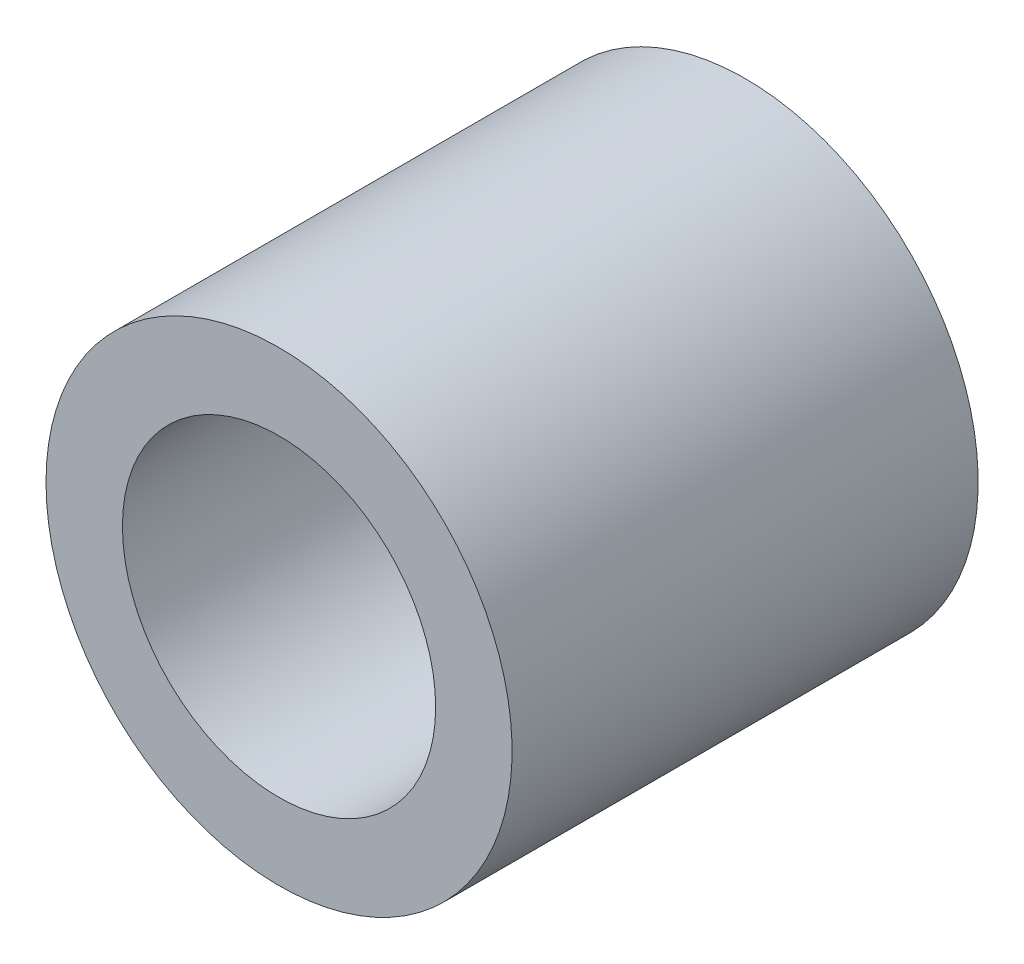
ISO-10303-21;
HEADER;
FILE_DESCRIPTION(('STEP AP214'),'2;1');
FILE_NAME('part.step','',(''),(''),'','','');
FILE_SCHEMA(('AUTOMOTIVE_DESIGN { 1 0 10303 214 1 1 1 1 }'));
ENDSEC;
DATA;
#1=APPLICATION_CONTEXT('core data for automotive mechanical design processes');
#2=APPLICATION_PROTOCOL_DEFINITION('international standard','automotive_design',2000,#1);
#3=PRODUCT_CONTEXT('',#1,'mechanical');
#4=PRODUCT('Part','Part','',(#3));
#5=PRODUCT_RELATED_PRODUCT_CATEGORY('part','',(#4));
#6=PRODUCT_DEFINITION_FORMATION('','',#4);
#7=PRODUCT_DEFINITION_CONTEXT('part definition',#1,'design');
#8=PRODUCT_DEFINITION('design','',#6,#7);
#9=PRODUCT_DEFINITION_SHAPE('','',#8);
#10=(LENGTH_UNIT() NAMED_UNIT(*) SI_UNIT(.MILLI.,.METRE.));
#11=(NAMED_UNIT(*) PLANE_ANGLE_UNIT() SI_UNIT($,.RADIAN.));
#12=(NAMED_UNIT(*) SI_UNIT($,.STERADIAN.) SOLID_ANGLE_UNIT());
#13=UNCERTAINTY_MEASURE_WITH_UNIT(LENGTH_MEASURE(1.E-05),#10,'distance_accuracy_value','');
#14=(GEOMETRIC_REPRESENTATION_CONTEXT(3) GLOBAL_UNCERTAINTY_ASSIGNED_CONTEXT((#13)) GLOBAL_UNIT_ASSIGNED_CONTEXT((#10,
#11,#12)) REPRESENTATION_CONTEXT('',''));
#15=CARTESIAN_POINT('',(0.,0.,0.));
#16=DIRECTION('',(0.,0.,1.));
#17=DIRECTION('',(1.,0.,0.));
#18=AXIS2_PLACEMENT_3D('',#15,#16,#17);
#19=CARTESIAN_POINT('',(0.,0.,4.7625));
#20=DIRECTION('',(0.,0.,1.));
#21=DIRECTION('',(1.,0.,0.));
#22=AXIS2_PLACEMENT_3D('',#19,#20,#21);
#23=PLANE('',#22);
#24=CARTESIAN_POINT('',(0.,0.,4.7625));
#25=DIRECTION('',(0.,0.,1.));
#26=DIRECTION('',(1.,0.,0.));
#27=AXIS2_PLACEMENT_3D('',#24,#25,#26);
#28=CIRCLE('',#27,4.7625);
#29=CARTESIAN_POINT('',(-4.7625,0.,4.7625));
#30=VERTEX_POINT('',#29);
#31=EDGE_CURVE('E10',#30,#30,#28,.T.);
#32=ORIENTED_EDGE('',*,*,#31,.T.);
#33=EDGE_LOOP('',(#32));
#34=FACE_BOUND('',#33,.T.);
#35=CARTESIAN_POINT('',(0.,0.,4.7625));
#36=DIRECTION('',(0.,0.,1.));
#37=DIRECTION('',(1.,0.,0.));
#38=AXIS2_PLACEMENT_3D('',#35,#36,#37);
#39=CIRCLE('',#38,3.2004);
#40=CARTESIAN_POINT('',(-3.2004,0.,4.7625));
#41=VERTEX_POINT('',#40);
#42=EDGE_CURVE('E41',#41,#41,#39,.T.);
#43=ORIENTED_EDGE('',*,*,#42,.F.);
#44=EDGE_LOOP('',(#43));
#45=FACE_BOUND('',#44,.T.);
#46=ADVANCED_FACE('F30',(#34,#45),#23,.T.);
#47=CARTESIAN_POINT('',(0.,0.,-4.7625));
#48=DIRECTION('',(0.,0.,1.));
#49=DIRECTION('',(1.,0.,0.));
#50=AXIS2_PLACEMENT_3D('',#47,#48,#49);
#51=PLANE('',#50);
#52=CARTESIAN_POINT('',(0.,0.,-4.7625));
#53=DIRECTION('',(0.,0.,1.));
#54=DIRECTION('',(1.,0.,0.));
#55=AXIS2_PLACEMENT_3D('',#52,#53,#54);
#56=CIRCLE('',#55,4.7625);
#57=CARTESIAN_POINT('',(-4.7625,0.,-4.7625));
#58=VERTEX_POINT('',#57);
#59=EDGE_CURVE('E34',#58,#58,#56,.T.);
#60=ORIENTED_EDGE('',*,*,#59,.F.);
#61=EDGE_LOOP('',(#60));
#62=FACE_BOUND('',#61,.T.);
#63=CARTESIAN_POINT('',(0.,0.,-4.7625));
#64=DIRECTION('',(0.,0.,1.));
#65=DIRECTION('',(1.,0.,0.));
#66=AXIS2_PLACEMENT_3D('',#63,#64,#65);
#67=CIRCLE('',#66,3.2004);
#68=CARTESIAN_POINT('',(-3.2004,0.,-4.7625));
#69=VERTEX_POINT('',#68);
#70=EDGE_CURVE('E43',#69,#69,#67,.T.);
#71=ORIENTED_EDGE('',*,*,#70,.T.);
#72=EDGE_LOOP('',(#71));
#73=FACE_BOUND('',#72,.T.);
#74=ADVANCED_FACE('F53',(#62,#73),#51,.F.);
#75=CARTESIAN_POINT('',(0.,0.,4.7625));
#76=DIRECTION('',(0.,0.,-1.));
#77=DIRECTION('',(-1.,0.,0.));
#78=AXIS2_PLACEMENT_3D('',#75,#76,#77);
#79=CYLINDRICAL_SURFACE('',#78,4.7625);
#80=CARTESIAN_POINT('',(-4.7625,0.,4.7625));
#81=CARTESIAN_POINT('',(-4.7625,0.,4.66328125));
#82=CARTESIAN_POINT('',(-4.7625,0.,4.5640625));
#83=CARTESIAN_POINT('',(-4.7625,0.,4.365625));
#84=CARTESIAN_POINT('',(-4.7625,0.,4.26640625));
#85=CARTESIAN_POINT('',(-4.7625,0.,4.06796875));
#86=CARTESIAN_POINT('',(-4.7625,0.,3.96875));
#87=CARTESIAN_POINT('',(-4.7625,0.,3.7703125));
#88=CARTESIAN_POINT('',(-4.7625,0.,3.67109375));
#89=CARTESIAN_POINT('',(-4.7625,0.,3.47265625));
#90=CARTESIAN_POINT('',(-4.7625,0.,3.3734375));
#91=CARTESIAN_POINT('',(-4.7625,0.,3.175));
#92=CARTESIAN_POINT('',(-4.7625,0.,3.07578125));
#93=CARTESIAN_POINT('',(-4.7625,0.,2.87734375));
#94=CARTESIAN_POINT('',(-4.7625,0.,2.778125));
#95=CARTESIAN_POINT('',(-4.7625,0.,2.5796875));
#96=CARTESIAN_POINT('',(-4.7625,0.,2.48046875));
#97=CARTESIAN_POINT('',(-4.7625,0.,2.28203125));
#98=CARTESIAN_POINT('',(-4.7625,0.,2.1828125));
#99=CARTESIAN_POINT('',(-4.7625,0.,1.984375));
#100=CARTESIAN_POINT('',(-4.7625,0.,1.88515625));
#101=CARTESIAN_POINT('',(-4.7625,0.,1.68671875));
#102=CARTESIAN_POINT('',(-4.7625,0.,1.5875));
#103=CARTESIAN_POINT('',(-4.7625,0.,1.3890625));
#104=CARTESIAN_POINT('',(-4.7625,0.,1.28984375));
#105=CARTESIAN_POINT('',(-4.7625,0.,1.09140625));
#106=CARTESIAN_POINT('',(-4.7625,0.,0.992187499999999));
#107=CARTESIAN_POINT('',(-4.7625,0.,0.79375));
#108=CARTESIAN_POINT('',(-4.7625,0.,0.69453125));
#109=CARTESIAN_POINT('',(-4.7625,0.,0.49609375));
#110=CARTESIAN_POINT('',(-4.7625,0.,0.396875));
#111=CARTESIAN_POINT('',(-4.7625,0.,0.1984375));
#112=CARTESIAN_POINT('',(-4.7625,0.,0.0992187500000001));
#113=CARTESIAN_POINT('',(-4.7625,0.,-0.0992187500000001));
#114=CARTESIAN_POINT('',(-4.7625,0.,-0.1984375));
#115=CARTESIAN_POINT('',(-4.7625,0.,-0.396875));
#116=CARTESIAN_POINT('',(-4.7625,0.,-0.49609375));
#117=CARTESIAN_POINT('',(-4.7625,0.,-0.69453125));
#118=CARTESIAN_POINT('',(-4.7625,0.,-0.793750000000001));
#119=CARTESIAN_POINT('',(-4.7625,0.,-0.992187500000001));
#120=CARTESIAN_POINT('',(-4.7625,0.,-1.09140625));
#121=CARTESIAN_POINT('',(-4.7625,0.,-1.28984375));
#122=CARTESIAN_POINT('',(-4.7625,0.,-1.3890625));
#123=CARTESIAN_POINT('',(-4.7625,0.,-1.5875));
#124=CARTESIAN_POINT('',(-4.7625,0.,-1.68671875));
#125=CARTESIAN_POINT('',(-4.7625,0.,-1.88515625));
#126=CARTESIAN_POINT('',(-4.7625,0.,-1.984375));
#127=CARTESIAN_POINT('',(-4.7625,0.,-2.1828125));
#128=CARTESIAN_POINT('',(-4.7625,0.,-2.28203125));
#129=CARTESIAN_POINT('',(-4.7625,0.,-2.48046875));
#130=CARTESIAN_POINT('',(-4.7625,0.,-2.5796875));
#131=CARTESIAN_POINT('',(-4.7625,0.,-2.778125));
#132=CARTESIAN_POINT('',(-4.7625,0.,-2.87734375));
#133=CARTESIAN_POINT('',(-4.7625,0.,-3.07578125));
#134=CARTESIAN_POINT('',(-4.7625,0.,-3.175));
#135=CARTESIAN_POINT('',(-4.7625,0.,-3.3734375));
#136=CARTESIAN_POINT('',(-4.7625,0.,-3.47265625));
#137=CARTESIAN_POINT('',(-4.7625,0.,-3.67109375));
#138=CARTESIAN_POINT('',(-4.7625,0.,-3.7703125));
#139=CARTESIAN_POINT('',(-4.7625,0.,-3.96875));
#140=CARTESIAN_POINT('',(-4.7625,0.,-4.06796875));
#141=CARTESIAN_POINT('',(-4.7625,0.,-4.26640625));
#142=CARTESIAN_POINT('',(-4.7625,0.,-4.365625));
#143=CARTESIAN_POINT('',(-4.7625,0.,-4.5640625));
#144=CARTESIAN_POINT('',(-4.7625,0.,-4.66328125));
#145=CARTESIAN_POINT('',(-4.7625,0.,-4.7625));
#146=B_SPLINE_CURVE_WITH_KNOTS('',3,(#80,#81,#82,#83,#84,#85,#86,#87,#88,#89,#90,#91,#92,#93,
#94,#95,#96,#97,#98,#99,#100,#101,#102,#103,#104,#105,#106,#107,#108,#109,#110,#111,#112,#113,
#114,#115,#116,#117,#118,#119,#120,#121,#122,#123,#124,#125,#126,#127,#128,#129,#130,#131,#132,
#133,#134,#135,#136,#137,#138,#139,#140,#141,#142,#143,#144,#145),.UNSPECIFIED.,.F.,.F.,(4,2,2,
2,2,2,2,2,2,2,2,2,2,2,2,2,2,2,2,2,2,2,2,2,2,2,2,2,2,2,2,2,4),(0.,0.29765625,0.5953125,
0.892968750000001,1.190625,1.48828125,1.7859375,2.08359375,2.38125,2.67890625,2.9765625,
3.27421875,3.571875,3.86953125,4.1671875,4.46484375,4.7625,5.06015625,5.3578125,5.65546875,
5.953125,6.25078125,6.5484375,6.84609375,7.14375,7.44140625,7.7390625,8.03671875,8.334375,
8.63203125,8.9296875,9.22734375,9.525),.UNSPECIFIED.);
#147=EDGE_CURVE('BSEAM32',#30,#58,#146,.T.);
#148=ORIENTED_EDGE('',*,*,#31,.F.);
#149=ORIENTED_EDGE('',*,*,#59,.T.);
#150=ORIENTED_EDGE('',*,*,#147,.T.);
#151=ORIENTED_EDGE('',*,*,#147,.F.);
#152=EDGE_LOOP('',(#148,#150,#149,#151));
#153=FACE_BOUND('',#152,.T.);
#154=ADVANCED_FACE('F32',(#153),#79,.T.);
#155=CARTESIAN_POINT('',(0.,0.,4.7625));
#156=DIRECTION('',(0.,0.,-1.));
#157=DIRECTION('',(-1.,0.,0.));
#158=AXIS2_PLACEMENT_3D('',#155,#156,#157);
#159=CYLINDRICAL_SURFACE('',#158,3.2004);
#160=CARTESIAN_POINT('',(-3.2004,0.,4.7625));
#161=CARTESIAN_POINT('',(-3.2004,0.,4.66328125));
#162=CARTESIAN_POINT('',(-3.2004,0.,4.5640625));
#163=CARTESIAN_POINT('',(-3.2004,0.,4.365625));
#164=CARTESIAN_POINT('',(-3.2004,0.,4.26640625));
#165=CARTESIAN_POINT('',(-3.2004,0.,4.06796875));
#166=CARTESIAN_POINT('',(-3.2004,0.,3.96875));
#167=CARTESIAN_POINT('',(-3.2004,0.,3.7703125));
#168=CARTESIAN_POINT('',(-3.2004,0.,3.67109375));
#169=CARTESIAN_POINT('',(-3.2004,0.,3.47265625));
#170=CARTESIAN_POINT('',(-3.2004,0.,3.3734375));
#171=CARTESIAN_POINT('',(-3.2004,0.,3.175));
#172=CARTESIAN_POINT('',(-3.2004,0.,3.07578125));
#173=CARTESIAN_POINT('',(-3.2004,0.,2.87734375));
#174=CARTESIAN_POINT('',(-3.2004,0.,2.778125));
#175=CARTESIAN_POINT('',(-3.2004,0.,2.5796875));
#176=CARTESIAN_POINT('',(-3.2004,0.,2.48046875));
#177=CARTESIAN_POINT('',(-3.2004,0.,2.28203125));
#178=CARTESIAN_POINT('',(-3.2004,0.,2.1828125));
#179=CARTESIAN_POINT('',(-3.2004,0.,1.984375));
#180=CARTESIAN_POINT('',(-3.2004,0.,1.88515625));
#181=CARTESIAN_POINT('',(-3.2004,0.,1.68671875));
#182=CARTESIAN_POINT('',(-3.2004,0.,1.5875));
#183=CARTESIAN_POINT('',(-3.2004,0.,1.3890625));
#184=CARTESIAN_POINT('',(-3.2004,0.,1.28984375));
#185=CARTESIAN_POINT('',(-3.2004,0.,1.09140625));
#186=CARTESIAN_POINT('',(-3.2004,0.,0.992187499999999));
#187=CARTESIAN_POINT('',(-3.2004,0.,0.79375));
#188=CARTESIAN_POINT('',(-3.2004,0.,0.69453125));
#189=CARTESIAN_POINT('',(-3.2004,0.,0.49609375));
#190=CARTESIAN_POINT('',(-3.2004,0.,0.396875));
#191=CARTESIAN_POINT('',(-3.2004,0.,0.1984375));
#192=CARTESIAN_POINT('',(-3.2004,0.,0.0992187500000001));
#193=CARTESIAN_POINT('',(-3.2004,0.,-0.0992187500000001));
#194=CARTESIAN_POINT('',(-3.2004,0.,-0.1984375));
#195=CARTESIAN_POINT('',(-3.2004,0.,-0.396875));
#196=CARTESIAN_POINT('',(-3.2004,0.,-0.49609375));
#197=CARTESIAN_POINT('',(-3.2004,0.,-0.69453125));
#198=CARTESIAN_POINT('',(-3.2004,0.,-0.793750000000001));
#199=CARTESIAN_POINT('',(-3.2004,0.,-0.992187500000001));
#200=CARTESIAN_POINT('',(-3.2004,0.,-1.09140625));
#201=CARTESIAN_POINT('',(-3.2004,0.,-1.28984375));
#202=CARTESIAN_POINT('',(-3.2004,0.,-1.3890625));
#203=CARTESIAN_POINT('',(-3.2004,0.,-1.5875));
#204=CARTESIAN_POINT('',(-3.2004,0.,-1.68671875));
#205=CARTESIAN_POINT('',(-3.2004,0.,-1.88515625));
#206=CARTESIAN_POINT('',(-3.2004,0.,-1.984375));
#207=CARTESIAN_POINT('',(-3.2004,0.,-2.1828125));
#208=CARTESIAN_POINT('',(-3.2004,0.,-2.28203125));
#209=CARTESIAN_POINT('',(-3.2004,0.,-2.48046875));
#210=CARTESIAN_POINT('',(-3.2004,0.,-2.5796875));
#211=CARTESIAN_POINT('',(-3.2004,0.,-2.778125));
#212=CARTESIAN_POINT('',(-3.2004,0.,-2.87734375));
#213=CARTESIAN_POINT('',(-3.2004,0.,-3.07578125));
#214=CARTESIAN_POINT('',(-3.2004,0.,-3.175));
#215=CARTESIAN_POINT('',(-3.2004,0.,-3.3734375));
#216=CARTESIAN_POINT('',(-3.2004,0.,-3.47265625));
#217=CARTESIAN_POINT('',(-3.2004,0.,-3.67109375));
#218=CARTESIAN_POINT('',(-3.2004,0.,-3.7703125));
#219=CARTESIAN_POINT('',(-3.2004,0.,-3.96875));
#220=CARTESIAN_POINT('',(-3.2004,0.,-4.06796875));
#221=CARTESIAN_POINT('',(-3.2004,0.,-4.26640625));
#222=CARTESIAN_POINT('',(-3.2004,0.,-4.365625));
#223=CARTESIAN_POINT('',(-3.2004,0.,-4.5640625));
#224=CARTESIAN_POINT('',(-3.2004,0.,-4.66328125));
#225=CARTESIAN_POINT('',(-3.2004,0.,-4.7625));
#226=B_SPLINE_CURVE_WITH_KNOTS('',3,(#160,#161,#162,#163,#164,#165,#166,#167,#168,#169,#170,
#171,#172,#173,#174,#175,#176,#177,#178,#179,#180,#181,#182,#183,#184,#185,#186,#187,#188,#189,
#190,#191,#192,#193,#194,#195,#196,#197,#198,#199,#200,#201,#202,#203,#204,#205,#206,#207,#208,
#209,#210,#211,#212,#213,#214,#215,#216,#217,#218,#219,#220,#221,#222,#223,#224,#225),
.UNSPECIFIED.,.F.,.F.,(4,2,2,2,2,2,2,2,2,2,2,2,2,2,2,2,2,2,2,2,2,2,2,2,2,2,2,2,2,2,2,2,4),(0.,
0.29765625,0.5953125,0.892968750000001,1.190625,1.48828125,1.7859375,2.08359375,2.38125,
2.67890625,2.9765625,3.27421875,3.571875,3.86953125,4.1671875,4.46484375,4.7625,5.06015625,
5.3578125,5.65546875,5.953125,6.25078125,6.5484375,6.84609375,7.14375,7.44140625,7.7390625,
8.03671875,8.334375,8.63203125,8.9296875,9.22734375,9.525),.UNSPECIFIED.);
#227=EDGE_CURVE('BSEAM49',#41,#69,#226,.T.);
#228=ORIENTED_EDGE('',*,*,#42,.T.);
#229=ORIENTED_EDGE('',*,*,#70,.F.);
#230=ORIENTED_EDGE('',*,*,#227,.T.);
#231=ORIENTED_EDGE('',*,*,#227,.F.);
#232=EDGE_LOOP('',(#228,#230,#229,#231));
#233=FACE_BOUND('',#232,.T.);
#234=ADVANCED_FACE('F49',(#233),#159,.F.);
#235=CLOSED_SHELL('',(#46,#74,#154,#234));
#236=MANIFOLD_SOLID_BREP('B2',#235);
#237=ADVANCED_BREP_SHAPE_REPRESENTATION('',(#18,#236),#14);
#238=SHAPE_DEFINITION_REPRESENTATION(#9,#237);
ENDSEC;
END-ISO-10303-21;
